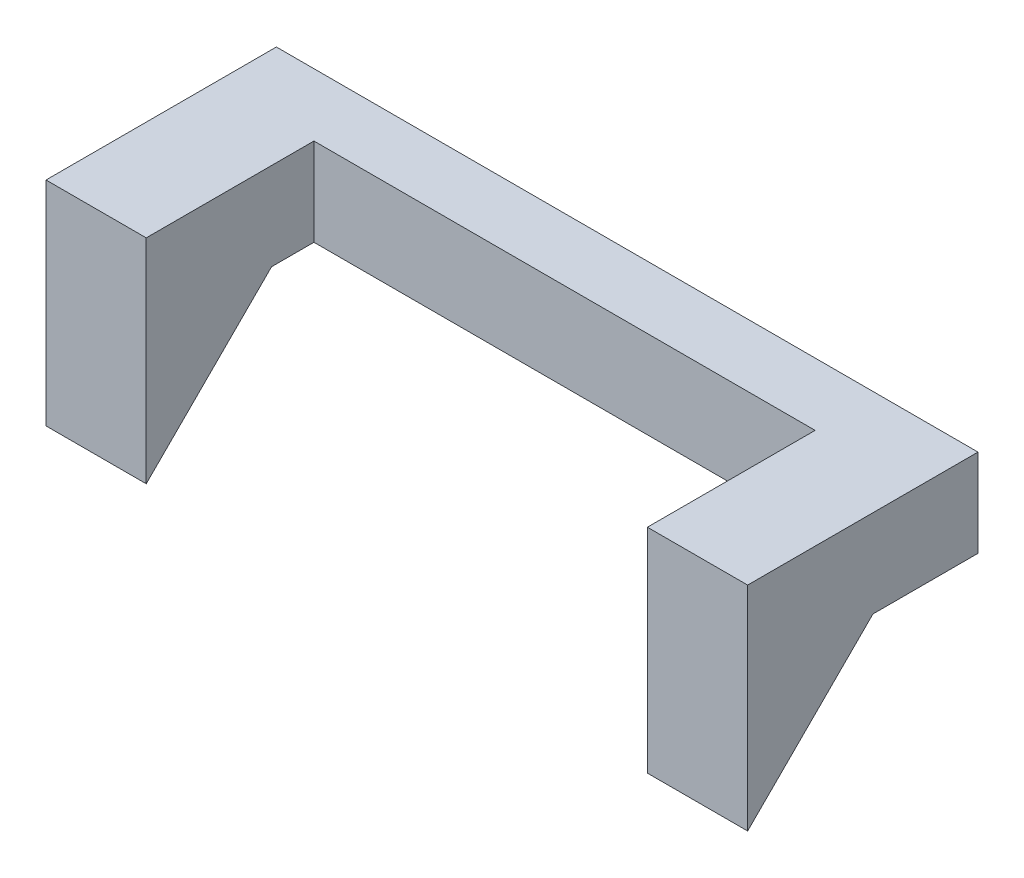
ISO-10303-21;
HEADER;
FILE_DESCRIPTION(('STEP AP214'),'2;1');
FILE_NAME('part.step','',(''),(''),'','','');
FILE_SCHEMA(('AUTOMOTIVE_DESIGN { 1 0 10303 214 1 1 1 1 }'));
ENDSEC;
DATA;
#1=APPLICATION_CONTEXT('core data for automotive mechanical design processes');
#2=APPLICATION_PROTOCOL_DEFINITION('international standard','automotive_design',2000,#1);
#3=PRODUCT_CONTEXT('',#1,'mechanical');
#4=PRODUCT('Part','Part','',(#3));
#5=PRODUCT_RELATED_PRODUCT_CATEGORY('part','',(#4));
#6=PRODUCT_DEFINITION_FORMATION('','',#4);
#7=PRODUCT_DEFINITION_CONTEXT('part definition',#1,'design');
#8=PRODUCT_DEFINITION('design','',#6,#7);
#9=PRODUCT_DEFINITION_SHAPE('','',#8);
#10=(LENGTH_UNIT() NAMED_UNIT(*) SI_UNIT(.MILLI.,.METRE.));
#11=(NAMED_UNIT(*) PLANE_ANGLE_UNIT() SI_UNIT($,.RADIAN.));
#12=(NAMED_UNIT(*) SI_UNIT($,.STERADIAN.) SOLID_ANGLE_UNIT());
#13=UNCERTAINTY_MEASURE_WITH_UNIT(LENGTH_MEASURE(1.E-05),#10,'distance_accuracy_value','');
#14=(GEOMETRIC_REPRESENTATION_CONTEXT(3) GLOBAL_UNCERTAINTY_ASSIGNED_CONTEXT((#13)) GLOBAL_UNIT_ASSIGNED_CONTEXT((#10,
#11,#12)) REPRESENTATION_CONTEXT('',''));
#15=CARTESIAN_POINT('',(0.,0.,0.));
#16=DIRECTION('',(0.,0.,1.));
#17=DIRECTION('',(1.,0.,0.));
#18=AXIS2_PLACEMENT_3D('',#15,#16,#17);
#19=CARTESIAN_POINT('',(106.941032585331,56.253661386131,6.35));
#20=DIRECTION('',(0.,1.,0.));
#21=DIRECTION('',(0.,0.,1.));
#22=AXIS2_PLACEMENT_3D('',#19,#20,#21);
#23=PLANE('',#22);
#24=DIRECTION('',(1.,0.,0.));
#25=VECTOR('',#24,1.);
#26=CARTESIAN_POINT('',(117.101032585331,56.253661386131,10.65));
#27=LINE('',#26,#25);
#28=CARTESIAN_POINT('',(106.941032585331,56.253661386131,10.65));
#29=VERTEX_POINT('',#28);
#30=CARTESIAN_POINT('',(117.101032585331,56.253661386131,10.65));
#31=VERTEX_POINT('',#30);
#32=EDGE_CURVE('E119',#29,#31,#27,.T.);
#33=ORIENTED_EDGE('',*,*,#32,.F.);
#34=DIRECTION('',(0.,0.,-1.));
#35=VECTOR('',#34,1.);
#36=CARTESIAN_POINT('',(106.941032585331,56.253661386131,6.35));
#37=LINE('',#36,#35);
#38=CARTESIAN_POINT('',(106.941032585331,56.253661386131,0.));
#39=VERTEX_POINT('',#38);
#40=EDGE_CURVE('E123',#29,#39,#37,.T.);
#41=ORIENTED_EDGE('',*,*,#40,.T.);
#42=DIRECTION('',(1.,0.,0.));
#43=VECTOR('',#42,1.);
#44=CARTESIAN_POINT('',(106.941032585331,56.253661386131,0.));
#45=LINE('',#44,#43);
#46=CARTESIAN_POINT('',(178.061032585331,56.253661386131,0.));
#47=VERTEX_POINT('',#46);
#48=EDGE_CURVE('E178',#39,#47,#45,.T.);
#49=ORIENTED_EDGE('',*,*,#48,.T.);
#50=DIRECTION('',(0.,0.,-1.));
#51=VECTOR('',#50,1.);
#52=CARTESIAN_POINT('',(178.061032585331,56.253661386131,6.35));
#53=LINE('',#52,#51);
#54=CARTESIAN_POINT('',(178.061032585331,56.253661386131,10.65));
#55=VERTEX_POINT('',#54);
#56=EDGE_CURVE('E189',#55,#47,#53,.T.);
#57=ORIENTED_EDGE('',*,*,#56,.F.);
#58=DIRECTION('',(1.,0.,0.));
#59=VECTOR('',#58,1.);
#60=CARTESIAN_POINT('',(178.061032585331,56.253661386131,10.65));
#61=LINE('',#60,#59);
#62=CARTESIAN_POINT('',(167.901032585331,56.253661386131,10.65));
#63=VERTEX_POINT('',#62);
#64=EDGE_CURVE('E52',#63,#55,#61,.T.);
#65=ORIENTED_EDGE('',*,*,#64,.F.);
#66=DIRECTION('',(0.,0.,-1.));
#67=VECTOR('',#66,1.);
#68=CARTESIAN_POINT('',(167.901032585331,56.253661386131,23.35));
#69=LINE('',#68,#67);
#70=CARTESIAN_POINT('',(167.901032585331,56.253661386131,6.35));
#71=VERTEX_POINT('',#70);
#72=EDGE_CURVE('E56',#63,#71,#69,.T.);
#73=ORIENTED_EDGE('',*,*,#72,.T.);
#74=DIRECTION('',(1.,0.,0.));
#75=VECTOR('',#74,1.);
#76=CARTESIAN_POINT('',(106.941032585331,56.253661386131,6.35));
#77=LINE('',#76,#75);
#78=CARTESIAN_POINT('',(117.101032585331,56.253661386131,6.35));
#79=VERTEX_POINT('',#78);
#80=EDGE_CURVE('E170',#79,#71,#77,.T.);
#81=ORIENTED_EDGE('',*,*,#80,.F.);
#82=DIRECTION('',(0.,0.,-1.));
#83=VECTOR('',#82,1.);
#84=CARTESIAN_POINT('',(117.101032585331,56.253661386131,23.35));
#85=LINE('',#84,#83);
#86=EDGE_CURVE('E167',#31,#79,#85,.T.);
#87=ORIENTED_EDGE('',*,*,#86,.F.);
#88=EDGE_LOOP('',(#33,#41,#49,#57,#65,#73,#81,#87));
#89=FACE_BOUND('',#88,.T.);
#90=ADVANCED_FACE('F36',(#89),#23,.F.);
#91=CARTESIAN_POINT('',(0.,0.,6.35));
#92=DIRECTION('',(0.,0.,-1.));
#93=DIRECTION('',(-1.,0.,0.));
#94=AXIS2_PLACEMENT_3D('',#91,#92,#93);
#95=PLANE('',#94);
#96=DIRECTION('',(0.,-1.,0.));
#97=VECTOR('',#96,1.);
#98=CARTESIAN_POINT('',(167.901032585331,56.253661386131,6.35));
#99=LINE('',#98,#97);
#100=CARTESIAN_POINT('',(167.901032585331,65.143661386131,6.35));
#101=VERTEX_POINT('',#100);
#102=EDGE_CURVE('E146',#101,#71,#99,.T.);
#103=ORIENTED_EDGE('',*,*,#102,.F.);
#104=DIRECTION('',(-1.,0.,0.));
#105=VECTOR('',#104,1.);
#106=CARTESIAN_POINT('',(106.941032585331,65.143661386131,6.35));
#107=LINE('',#106,#105);
#108=CARTESIAN_POINT('',(117.101032585331,65.143661386131,6.35));
#109=VERTEX_POINT('',#108);
#110=EDGE_CURVE('E172',#101,#109,#107,.T.);
#111=ORIENTED_EDGE('',*,*,#110,.T.);
#112=DIRECTION('',(0.,1.,0.));
#113=VECTOR('',#112,1.);
#114=CARTESIAN_POINT('',(117.101032585331,56.253661386131,6.35));
#115=LINE('',#114,#113);
#116=EDGE_CURVE('E162',#79,#109,#115,.T.);
#117=ORIENTED_EDGE('',*,*,#116,.F.);
#118=ORIENTED_EDGE('',*,*,#80,.T.);
#119=EDGE_LOOP('',(#103,#111,#117,#118));
#120=FACE_BOUND('',#119,.T.);
#121=ADVANCED_FACE('F211',(#120),#95,.F.);
#122=CARTESIAN_POINT('',(106.941032585331,56.253661386131,6.35));
#123=DIRECTION('',(1.,0.,0.));
#124=DIRECTION('',(0.,0.,-1.));
#125=AXIS2_PLACEMENT_3D('',#122,#123,#124);
#126=PLANE('',#125);
#127=ORIENTED_EDGE('',*,*,#40,.F.);
#128=DIRECTION('',(0.,0.707106781186549,-0.707106781186546));
#129=VECTOR('',#128,1.);
#130=CARTESIAN_POINT('',(106.941032585331,43.553661386131,23.35));
#131=LINE('',#130,#129);
#132=CARTESIAN_POINT('',(106.941032585331,43.553661386131,23.35));
#133=VERTEX_POINT('',#132);
#134=EDGE_CURVE('E122',#29,#133,#131,.F.);
#135=ORIENTED_EDGE('',*,*,#134,.T.);
#136=DIRECTION('',(0.,-1.,0.));
#137=VECTOR('',#136,1.);
#138=CARTESIAN_POINT('',(106.941032585331,56.253661386131,23.35));
#139=LINE('',#138,#137);
#140=CARTESIAN_POINT('',(106.941032585331,65.143661386131,23.35));
#141=VERTEX_POINT('',#140);
#142=EDGE_CURVE('E135',#141,#133,#139,.T.);
#143=ORIENTED_EDGE('',*,*,#142,.F.);
#144=DIRECTION('',(0.,0.,-1.));
#145=VECTOR('',#144,1.);
#146=CARTESIAN_POINT('',(106.941032585331,65.143661386131,6.35));
#147=LINE('',#146,#145);
#148=CARTESIAN_POINT('',(106.941032585331,65.143661386131,0.));
#149=VERTEX_POINT('',#148);
#150=EDGE_CURVE('E175',#141,#149,#147,.T.);
#151=ORIENTED_EDGE('',*,*,#150,.T.);
#152=DIRECTION('',(0.,-1.,0.));
#153=VECTOR('',#152,1.);
#154=CARTESIAN_POINT('',(106.941032585331,56.253661386131,0.));
#155=LINE('',#154,#153);
#156=EDGE_CURVE('E169',#149,#39,#155,.T.);
#157=ORIENTED_EDGE('',*,*,#156,.T.);
#158=EDGE_LOOP('',(#127,#135,#143,#151,#157));
#159=FACE_BOUND('',#158,.T.);
#160=ADVANCED_FACE('F215',(#159),#126,.F.);
#161=CARTESIAN_POINT('',(178.061032585331,56.253661386131,6.35));
#162=DIRECTION('',(-1.,0.,0.));
#163=DIRECTION('',(0.,0.,1.));
#164=AXIS2_PLACEMENT_3D('',#161,#162,#163);
#165=PLANE('',#164);
#166=DIRECTION('',(0.,1.,0.));
#167=VECTOR('',#166,1.);
#168=CARTESIAN_POINT('',(178.061032585331,56.253661386131,23.35));
#169=LINE('',#168,#167);
#170=CARTESIAN_POINT('',(178.061032585331,43.553661386131,23.35));
#171=VERTEX_POINT('',#170);
#172=CARTESIAN_POINT('',(178.061032585331,65.143661386131,23.35));
#173=VERTEX_POINT('',#172);
#174=EDGE_CURVE('E148',#171,#173,#169,.T.);
#175=ORIENTED_EDGE('',*,*,#174,.F.);
#176=DIRECTION('',(0.,-0.707106781186549,0.707106781186546));
#177=VECTOR('',#176,1.);
#178=CARTESIAN_POINT('',(178.061032585331,43.5536613861311,23.35));
#179=LINE('',#178,#177);
#180=EDGE_CURVE('E45',#171,#55,#179,.F.);
#181=ORIENTED_EDGE('',*,*,#180,.T.);
#182=ORIENTED_EDGE('',*,*,#56,.T.);
#183=DIRECTION('',(0.,1.,0.));
#184=VECTOR('',#183,1.);
#185=CARTESIAN_POINT('',(178.061032585331,56.253661386131,0.));
#186=LINE('',#185,#184);
#187=CARTESIAN_POINT('',(178.061032585331,65.143661386131,0.));
#188=VERTEX_POINT('',#187);
#189=EDGE_CURVE('E181',#47,#188,#186,.T.);
#190=ORIENTED_EDGE('',*,*,#189,.T.);
#191=DIRECTION('',(0.,0.,-1.));
#192=VECTOR('',#191,1.);
#193=CARTESIAN_POINT('',(178.061032585331,65.143661386131,6.35));
#194=LINE('',#193,#192);
#195=EDGE_CURVE('E186',#173,#188,#194,.T.);
#196=ORIENTED_EDGE('',*,*,#195,.F.);
#197=EDGE_LOOP('',(#175,#181,#182,#190,#196));
#198=FACE_BOUND('',#197,.T.);
#199=ADVANCED_FACE('F194',(#198),#165,.F.);
#200=CARTESIAN_POINT('',(106.941032585331,65.143661386131,6.35));
#201=DIRECTION('',(0.,-1.,0.));
#202=DIRECTION('',(0.,0.,-1.));
#203=AXIS2_PLACEMENT_3D('',#200,#201,#202);
#204=PLANE('',#203);
#205=DIRECTION('',(-1.,0.,0.));
#206=VECTOR('',#205,1.);
#207=CARTESIAN_POINT('',(106.941032585331,65.143661386131,0.));
#208=LINE('',#207,#206);
#209=EDGE_CURVE('E173',#188,#149,#208,.T.);
#210=ORIENTED_EDGE('',*,*,#209,.T.);
#211=ORIENTED_EDGE('',*,*,#150,.F.);
#212=DIRECTION('',(-1.,0.,0.));
#213=VECTOR('',#212,1.);
#214=CARTESIAN_POINT('',(106.941032585331,65.143661386131,23.35));
#215=LINE('',#214,#213);
#216=CARTESIAN_POINT('',(117.101032585331,65.143661386131,23.35));
#217=VERTEX_POINT('',#216);
#218=EDGE_CURVE('E134',#217,#141,#215,.T.);
#219=ORIENTED_EDGE('',*,*,#218,.F.);
#220=DIRECTION('',(0.,0.,-1.));
#221=VECTOR('',#220,1.);
#222=CARTESIAN_POINT('',(117.101032585331,65.143661386131,23.35));
#223=LINE('',#222,#221);
#224=EDGE_CURVE('E130',#217,#109,#223,.T.);
#225=ORIENTED_EDGE('',*,*,#224,.T.);
#226=ORIENTED_EDGE('',*,*,#110,.F.);
#227=DIRECTION('',(0.,0.,-1.));
#228=VECTOR('',#227,1.);
#229=CARTESIAN_POINT('',(167.901032585331,65.143661386131,23.35));
#230=LINE('',#229,#228);
#231=CARTESIAN_POINT('',(167.901032585331,65.143661386131,23.35));
#232=VERTEX_POINT('',#231);
#233=EDGE_CURVE('E159',#232,#101,#230,.T.);
#234=ORIENTED_EDGE('',*,*,#233,.F.);
#235=DIRECTION('',(-1.,0.,0.));
#236=VECTOR('',#235,1.);
#237=CARTESIAN_POINT('',(178.061032585331,65.143661386131,23.35));
#238=LINE('',#237,#236);
#239=EDGE_CURVE('E151',#173,#232,#238,.T.);
#240=ORIENTED_EDGE('',*,*,#239,.F.);
#241=ORIENTED_EDGE('',*,*,#195,.T.);
#242=EDGE_LOOP('',(#210,#211,#219,#225,#226,#234,#240,#241));
#243=FACE_BOUND('',#242,.T.);
#244=ADVANCED_FACE('F208',(#243),#204,.F.);
#245=CARTESIAN_POINT('',(0.,0.,0.));
#246=DIRECTION('',(0.,0.,-1.));
#247=DIRECTION('',(-1.,0.,0.));
#248=AXIS2_PLACEMENT_3D('',#245,#246,#247);
#249=PLANE('',#248);
#250=ORIENTED_EDGE('',*,*,#156,.F.);
#251=ORIENTED_EDGE('',*,*,#209,.F.);
#252=ORIENTED_EDGE('',*,*,#189,.F.);
#253=ORIENTED_EDGE('',*,*,#48,.F.);
#254=EDGE_LOOP('',(#250,#251,#252,#253));
#255=FACE_BOUND('',#254,.T.);
#256=ADVANCED_FACE('F218',(#255),#249,.T.);
#257=CARTESIAN_POINT('',(117.101032585331,56.253661386131,23.35));
#258=DIRECTION('',(-1.,0.,0.));
#259=DIRECTION('',(0.,0.,1.));
#260=AXIS2_PLACEMENT_3D('',#257,#258,#259);
#261=PLANE('',#260);
#262=DIRECTION('',(0.,1.,0.));
#263=VECTOR('',#262,1.);
#264=CARTESIAN_POINT('',(117.101032585331,56.253661386131,23.35));
#265=LINE('',#264,#263);
#266=CARTESIAN_POINT('',(117.101032585331,43.553661386131,23.35));
#267=VERTEX_POINT('',#266);
#268=EDGE_CURVE('E126',#267,#217,#265,.T.);
#269=ORIENTED_EDGE('',*,*,#268,.F.);
#270=DIRECTION('',(0.,-0.707106781186549,0.707106781186546));
#271=VECTOR('',#270,1.);
#272=CARTESIAN_POINT('',(117.101032585331,43.553661386131,23.35));
#273=LINE('',#272,#271);
#274=EDGE_CURVE('E113',#267,#31,#273,.F.);
#275=ORIENTED_EDGE('',*,*,#274,.T.);
#276=ORIENTED_EDGE('',*,*,#86,.T.);
#277=ORIENTED_EDGE('',*,*,#116,.T.);
#278=ORIENTED_EDGE('',*,*,#224,.F.);
#279=EDGE_LOOP('',(#269,#275,#276,#277,#278));
#280=FACE_BOUND('',#279,.T.);
#281=ADVANCED_FACE('F127',(#280),#261,.F.);
#282=CARTESIAN_POINT('',(0.,0.,23.35));
#283=DIRECTION('',(0.,0.,-1.));
#284=DIRECTION('',(-1.,0.,0.));
#285=AXIS2_PLACEMENT_3D('',#282,#283,#284);
#286=PLANE('',#285);
#287=ORIENTED_EDGE('',*,*,#142,.T.);
#288=DIRECTION('',(-1.,0.,0.));
#289=VECTOR('',#288,1.);
#290=CARTESIAN_POINT('',(117.101032585331,43.553661386131,23.35));
#291=LINE('',#290,#289);
#292=EDGE_CURVE('E118',#267,#133,#291,.T.);
#293=ORIENTED_EDGE('',*,*,#292,.F.);
#294=ORIENTED_EDGE('',*,*,#268,.T.);
#295=ORIENTED_EDGE('',*,*,#218,.T.);
#296=EDGE_LOOP('',(#287,#293,#294,#295));
#297=FACE_BOUND('',#296,.T.);
#298=ADVANCED_FACE('F138',(#297),#286,.F.);
#299=CARTESIAN_POINT('',(167.901032585331,56.253661386131,23.35));
#300=DIRECTION('',(1.,0.,0.));
#301=DIRECTION('',(0.,0.,-1.));
#302=AXIS2_PLACEMENT_3D('',#299,#300,#301);
#303=PLANE('',#302);
#304=ORIENTED_EDGE('',*,*,#72,.F.);
#305=DIRECTION('',(0.,0.707106781186549,-0.707106781186546));
#306=VECTOR('',#305,1.);
#307=CARTESIAN_POINT('',(167.901032585331,43.5536613861311,23.35));
#308=LINE('',#307,#306);
#309=CARTESIAN_POINT('',(167.901032585331,43.553661386131,23.35));
#310=VERTEX_POINT('',#309);
#311=EDGE_CURVE('E11',#63,#310,#308,.F.);
#312=ORIENTED_EDGE('',*,*,#311,.T.);
#313=DIRECTION('',(0.,-1.,0.));
#314=VECTOR('',#313,1.);
#315=CARTESIAN_POINT('',(167.901032585331,56.253661386131,23.35));
#316=LINE('',#315,#314);
#317=EDGE_CURVE('E153',#232,#310,#316,.T.);
#318=ORIENTED_EDGE('',*,*,#317,.F.);
#319=ORIENTED_EDGE('',*,*,#233,.T.);
#320=ORIENTED_EDGE('',*,*,#102,.T.);
#321=EDGE_LOOP('',(#304,#312,#318,#319,#320));
#322=FACE_BOUND('',#321,.T.);
#323=ADVANCED_FACE('F202',(#322),#303,.F.);
#324=CARTESIAN_POINT('',(0.,0.,23.35));
#325=DIRECTION('',(0.,0.,1.));
#326=DIRECTION('',(1.,0.,0.));
#327=AXIS2_PLACEMENT_3D('',#324,#325,#326);
#328=PLANE('',#327);
#329=ORIENTED_EDGE('',*,*,#174,.T.);
#330=ORIENTED_EDGE('',*,*,#239,.T.);
#331=ORIENTED_EDGE('',*,*,#317,.T.);
#332=DIRECTION('',(-1.,0.,0.));
#333=VECTOR('',#332,1.);
#334=CARTESIAN_POINT('',(178.061032585331,43.553661386131,23.35));
#335=LINE('',#334,#333);
#336=EDGE_CURVE('E141',#171,#310,#335,.T.);
#337=ORIENTED_EDGE('',*,*,#336,.F.);
#338=EDGE_LOOP('',(#329,#330,#331,#337));
#339=FACE_BOUND('',#338,.T.);
#340=ADVANCED_FACE('F204',(#339),#328,.T.);
#341=CARTESIAN_POINT('',(0.,43.553661386131,23.35));
#342=DIRECTION('',(0.,0.707106781186546,0.707106781186549));
#343=DIRECTION('',(1.,0.,0.));
#344=AXIS2_PLACEMENT_3D('',#341,#342,#343);
#345=PLANE('',#344);
#346=ORIENTED_EDGE('',*,*,#134,.F.);
#347=ORIENTED_EDGE('',*,*,#32,.T.);
#348=ORIENTED_EDGE('',*,*,#274,.F.);
#349=ORIENTED_EDGE('',*,*,#292,.T.);
#350=EDGE_LOOP('',(#346,#347,#348,#349));
#351=FACE_BOUND('',#350,.T.);
#352=ADVANCED_FACE('F116',(#351),#345,.F.);
#353=CARTESIAN_POINT('',(0.,43.553661386131,23.3499999999999));
#354=DIRECTION('',(0.,0.707106781186546,0.707106781186549));
#355=DIRECTION('',(1.,0.,0.));
#356=AXIS2_PLACEMENT_3D('',#353,#354,#355);
#357=PLANE('',#356);
#358=ORIENTED_EDGE('',*,*,#311,.F.);
#359=ORIENTED_EDGE('',*,*,#64,.T.);
#360=ORIENTED_EDGE('',*,*,#180,.F.);
#361=ORIENTED_EDGE('',*,*,#336,.T.);
#362=EDGE_LOOP('',(#358,#359,#360,#361));
#363=FACE_BOUND('',#362,.T.);
#364=ADVANCED_FACE('F39',(#363),#357,.F.);
#365=CLOSED_SHELL('',(#90,#121,#160,#199,#244,#256,#281,#298,#323,#340,#352,#364));
#366=MANIFOLD_SOLID_BREP('B2',#365);
#367=ADVANCED_BREP_SHAPE_REPRESENTATION('',(#18,#366),#14);
#368=SHAPE_DEFINITION_REPRESENTATION(#9,#367);
ENDSEC;
END-ISO-10303-21;
